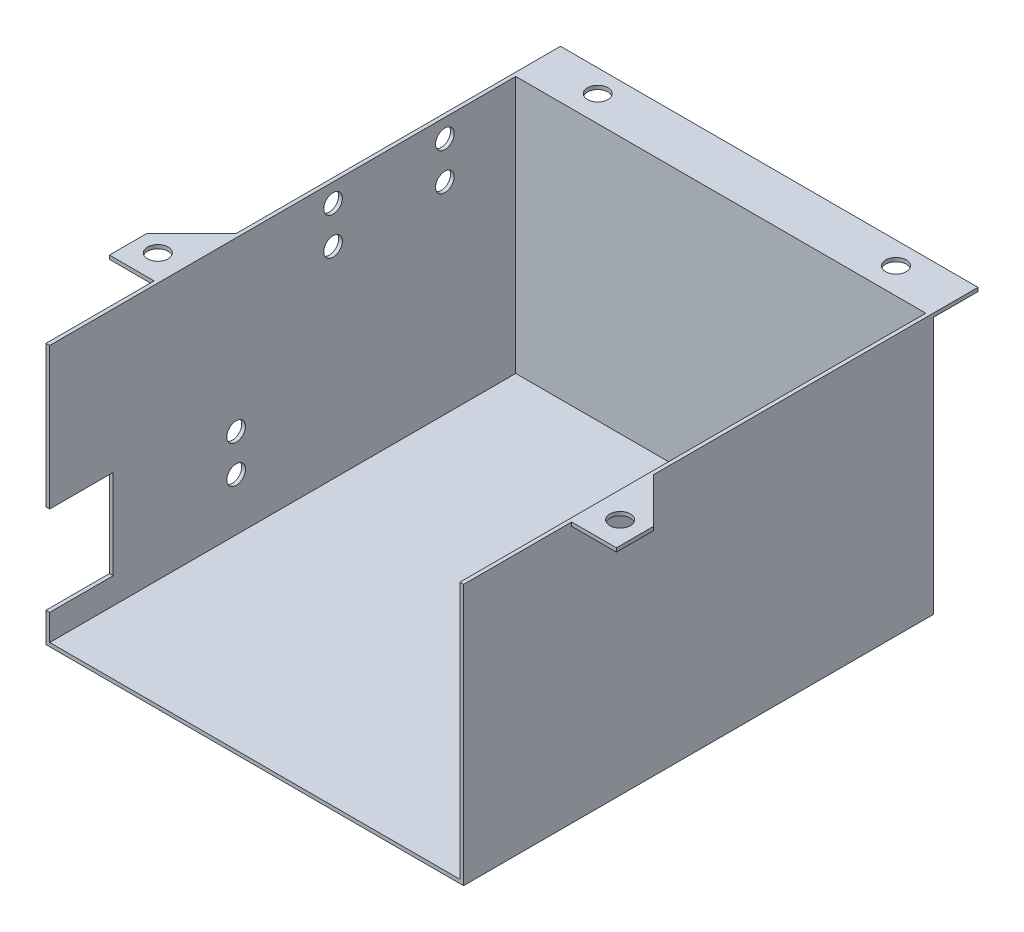
ISO-10303-21;
HEADER;
FILE_DESCRIPTION(('STEP AP214'),'2;1');
FILE_NAME('part.step','',(''),(''),'','','');
FILE_SCHEMA(('AUTOMOTIVE_DESIGN { 1 0 10303 214 1 1 1 1 }'));
ENDSEC;
DATA;
#1=APPLICATION_CONTEXT('core data for automotive mechanical design processes');
#2=APPLICATION_PROTOCOL_DEFINITION('international standard','automotive_design',2000,#1);
#3=PRODUCT_CONTEXT('',#1,'mechanical');
#4=PRODUCT('Part','Part','',(#3));
#5=PRODUCT_RELATED_PRODUCT_CATEGORY('part','',(#4));
#6=PRODUCT_DEFINITION_FORMATION('','',#4);
#7=PRODUCT_DEFINITION_CONTEXT('part definition',#1,'design');
#8=PRODUCT_DEFINITION('design','',#6,#7);
#9=PRODUCT_DEFINITION_SHAPE('','',#8);
#10=(LENGTH_UNIT() NAMED_UNIT(*) SI_UNIT(.MILLI.,.METRE.));
#11=(NAMED_UNIT(*) PLANE_ANGLE_UNIT() SI_UNIT($,.RADIAN.));
#12=(NAMED_UNIT(*) SI_UNIT($,.STERADIAN.) SOLID_ANGLE_UNIT());
#13=UNCERTAINTY_MEASURE_WITH_UNIT(LENGTH_MEASURE(1.E-05),#10,'distance_accuracy_value','');
#14=(GEOMETRIC_REPRESENTATION_CONTEXT(3) GLOBAL_UNCERTAINTY_ASSIGNED_CONTEXT((#13)) GLOBAL_UNIT_ASSIGNED_CONTEXT((#10,
#11,#12)) REPRESENTATION_CONTEXT('',''));
#15=CARTESIAN_POINT('',(0.,0.,0.));
#16=DIRECTION('',(0.,0.,1.));
#17=DIRECTION('',(1.,0.,0.));
#18=AXIS2_PLACEMENT_3D('',#15,#16,#17);
#19=CARTESIAN_POINT('',(0.,70.,126.));
#20=DIRECTION('',(0.,0.,-1.));
#21=DIRECTION('',(-1.,0.,0.));
#22=AXIS2_PLACEMENT_3D('',#19,#20,#21);
#23=PLANE('',#22);
#24=DIRECTION('',(0.,-1.,0.));
#25=VECTOR('',#24,1.);
#26=CARTESIAN_POINT('',(1.,70.,126.));
#27=LINE('',#26,#25);
#28=CARTESIAN_POINT('',(0.999999999999987,8.,126.));
#29=VERTEX_POINT('',#28);
#30=CARTESIAN_POINT('',(0.999999999999992,1.,126.));
#31=VERTEX_POINT('',#30);
#32=EDGE_CURVE('E263',#29,#31,#27,.T.);
#33=ORIENTED_EDGE('',*,*,#32,.F.);
#34=DIRECTION('',(-1.,0.,0.));
#35=VECTOR('',#34,1.);
#36=CARTESIAN_POINT('',(124.001025,8.,126.));
#37=LINE('',#36,#35);
#38=CARTESIAN_POINT('',(0.,8.,126.));
#39=VERTEX_POINT('',#38);
#40=EDGE_CURVE('E245',#29,#39,#37,.T.);
#41=ORIENTED_EDGE('',*,*,#40,.T.);
#42=DIRECTION('',(0.,-1.,0.));
#43=VECTOR('',#42,1.);
#44=CARTESIAN_POINT('',(0.,0.,126.));
#45=LINE('',#44,#43);
#46=CARTESIAN_POINT('',(0.,0.,126.));
#47=VERTEX_POINT('',#46);
#48=EDGE_CURVE('E322',#39,#47,#45,.T.);
#49=ORIENTED_EDGE('',*,*,#48,.T.);
#50=DIRECTION('',(1.,0.,0.));
#51=VECTOR('',#50,1.);
#52=CARTESIAN_POINT('',(0.,0.,126.));
#53=LINE('',#52,#51);
#54=CARTESIAN_POINT('',(112.,0.,126.));
#55=VERTEX_POINT('',#54);
#56=EDGE_CURVE('E330',#47,#55,#53,.T.);
#57=ORIENTED_EDGE('',*,*,#56,.T.);
#58=DIRECTION('',(0.,1.,0.));
#59=VECTOR('',#58,1.);
#60=CARTESIAN_POINT('',(112.,0.,126.));
#61=LINE('',#60,#59);
#62=CARTESIAN_POINT('',(112.,70.,126.));
#63=VERTEX_POINT('',#62);
#64=EDGE_CURVE('E333',#55,#63,#61,.T.);
#65=ORIENTED_EDGE('',*,*,#64,.T.);
#66=DIRECTION('',(-1.,0.,0.));
#67=VECTOR('',#66,1.);
#68=CARTESIAN_POINT('',(0.,70.,126.));
#69=LINE('',#68,#67);
#70=CARTESIAN_POINT('',(111.,70.,126.));
#71=VERTEX_POINT('',#70);
#72=EDGE_CURVE('E337',#63,#71,#69,.T.);
#73=ORIENTED_EDGE('',*,*,#72,.T.);
#74=DIRECTION('',(0.,1.,0.));
#75=VECTOR('',#74,1.);
#76=CARTESIAN_POINT('',(111.,70.,126.));
#77=LINE('',#76,#75);
#78=CARTESIAN_POINT('',(111.,1.,126.));
#79=VERTEX_POINT('',#78);
#80=EDGE_CURVE('E269',#79,#71,#77,.T.);
#81=ORIENTED_EDGE('',*,*,#80,.F.);
#82=DIRECTION('',(1.,0.,0.));
#83=VECTOR('',#82,1.);
#84=CARTESIAN_POINT('',(0.999999999999992,1.,126.));
#85=LINE('',#84,#83);
#86=EDGE_CURVE('E262',#31,#79,#85,.T.);
#87=ORIENTED_EDGE('',*,*,#86,.F.);
#88=EDGE_LOOP('',(#33,#41,#49,#57,#65,#73,#81,#87));
#89=FACE_BOUND('',#88,.T.);
#90=ADVANCED_FACE('F40',(#89),#23,.F.);
#91=CARTESIAN_POINT('',(0.,70.,126.));
#92=DIRECTION('',(0.,-1.,0.));
#93=DIRECTION('',(0.,0.,-1.));
#94=AXIS2_PLACEMENT_3D('',#91,#92,#93);
#95=PLANE('',#94);
#96=CARTESIAN_POINT('',(96.,70.,-6.));
#97=DIRECTION('',(0.,-1.,0.));
#98=DIRECTION('',(0.,0.,-1.));
#99=AXIS2_PLACEMENT_3D('',#96,#97,#98);
#100=CIRCLE('',#99,2.75000000000001);
#101=CARTESIAN_POINT('',(96.,70.,-8.75000000000001));
#102=VERTEX_POINT('',#101);
#103=EDGE_CURVE('E586',#102,#102,#100,.T.);
#104=ORIENTED_EDGE('',*,*,#103,.T.);
#105=EDGE_LOOP('',(#104));
#106=FACE_BOUND('',#105,.T.);
#107=CARTESIAN_POINT('',(16.,70.,-6.));
#108=DIRECTION('',(0.,-1.,0.));
#109=DIRECTION('',(0.,0.,-1.));
#110=AXIS2_PLACEMENT_3D('',#107,#108,#109);
#111=CIRCLE('',#110,2.75);
#112=CARTESIAN_POINT('',(16.,70.,-8.75));
#113=VERTEX_POINT('',#112);
#114=EDGE_CURVE('E476',#113,#113,#111,.T.);
#115=ORIENTED_EDGE('',*,*,#114,.T.);
#116=EDGE_LOOP('',(#115));
#117=FACE_BOUND('',#116,.T.);
#118=CARTESIAN_POINT('',(118.,70.,90.));
#119=DIRECTION('',(0.,-1.,0.));
#120=DIRECTION('',(0.,0.,-1.));
#121=AXIS2_PLACEMENT_3D('',#118,#119,#120);
#122=CIRCLE('',#121,2.75000000000001);
#123=CARTESIAN_POINT('',(118.,70.,87.25));
#124=VERTEX_POINT('',#123);
#125=EDGE_CURVE('E543',#124,#124,#122,.T.);
#126=ORIENTED_EDGE('',*,*,#125,.T.);
#127=EDGE_LOOP('',(#126));
#128=FACE_BOUND('',#127,.T.);
#129=CARTESIAN_POINT('',(-6.,70.,90.));
#130=DIRECTION('',(0.,-1.,0.));
#131=DIRECTION('',(0.,0.,-1.));
#132=AXIS2_PLACEMENT_3D('',#129,#130,#131);
#133=CIRCLE('',#132,2.75000000000001);
#134=CARTESIAN_POINT('',(-6.,70.,87.25));
#135=VERTEX_POINT('',#134);
#136=EDGE_CURVE('E535',#135,#135,#133,.T.);
#137=ORIENTED_EDGE('',*,*,#136,.T.);
#138=EDGE_LOOP('',(#137));
#139=FACE_BOUND('',#138,.T.);
#140=DIRECTION('',(-0.707106781186552,0.,0.707106781186544));
#141=VECTOR('',#140,1.);
#142=CARTESIAN_POINT('',(0.,70.,75.));
#143=LINE('',#142,#141);
#144=CARTESIAN_POINT('',(0.,70.,75.));
#145=VERTEX_POINT('',#144);
#146=CARTESIAN_POINT('',(-12.,70.,86.9999999999999));
#147=VERTEX_POINT('',#146);
#148=EDGE_CURVE('E538',#145,#147,#143,.T.);
#149=ORIENTED_EDGE('',*,*,#148,.T.);
#150=DIRECTION('',(0.,0.,1.));
#151=VECTOR('',#150,1.);
#152=CARTESIAN_POINT('',(-12.,70.,97.));
#153=LINE('',#152,#151);
#154=CARTESIAN_POINT('',(-12.,70.,97.));
#155=VERTEX_POINT('',#154);
#156=EDGE_CURVE('E547',#147,#155,#153,.T.);
#157=ORIENTED_EDGE('',*,*,#156,.T.);
#158=DIRECTION('',(1.,0.,0.));
#159=VECTOR('',#158,1.);
#160=CARTESIAN_POINT('',(-12.,70.,97.));
#161=LINE('',#160,#159);
#162=CARTESIAN_POINT('',(0.,70.,97.));
#163=VERTEX_POINT('',#162);
#164=EDGE_CURVE('E360',#155,#163,#161,.T.);
#165=ORIENTED_EDGE('',*,*,#164,.T.);
#166=DIRECTION('',(0.,0.,-1.));
#167=VECTOR('',#166,1.);
#168=CARTESIAN_POINT('',(0.,70.,126.));
#169=LINE('',#168,#167);
#170=CARTESIAN_POINT('',(0.,70.,126.));
#171=VERTEX_POINT('',#170);
#172=EDGE_CURVE('E349',#171,#163,#169,.T.);
#173=ORIENTED_EDGE('',*,*,#172,.F.);
#174=CARTESIAN_POINT('',(1.,70.,126.));
#175=VERTEX_POINT('',#174);
#176=EDGE_CURVE('E336',#175,#171,#69,.T.);
#177=ORIENTED_EDGE('',*,*,#176,.F.);
#178=DIRECTION('',(0.,0.,1.));
#179=VECTOR('',#178,1.);
#180=CARTESIAN_POINT('',(1.,70.,1.));
#181=LINE('',#180,#179);
#182=CARTESIAN_POINT('',(1.,70.,1.));
#183=VERTEX_POINT('',#182);
#184=EDGE_CURVE('E260',#183,#175,#181,.T.);
#185=ORIENTED_EDGE('',*,*,#184,.F.);
#186=DIRECTION('',(-1.,0.,0.));
#187=VECTOR('',#186,1.);
#188=CARTESIAN_POINT('',(1.,70.,1.));
#189=LINE('',#188,#187);
#190=CARTESIAN_POINT('',(111.,70.,1.));
#191=VERTEX_POINT('',#190);
#192=EDGE_CURVE('E291',#191,#183,#189,.T.);
#193=ORIENTED_EDGE('',*,*,#192,.F.);
#194=DIRECTION('',(0.,0.,1.));
#195=VECTOR('',#194,1.);
#196=CARTESIAN_POINT('',(111.,70.,1.));
#197=LINE('',#196,#195);
#198=EDGE_CURVE('E298',#191,#71,#197,.T.);
#199=ORIENTED_EDGE('',*,*,#198,.T.);
#200=ORIENTED_EDGE('',*,*,#72,.F.);
#201=DIRECTION('',(0.,0.,-1.));
#202=VECTOR('',#201,1.);
#203=CARTESIAN_POINT('',(112.,70.,126.));
#204=LINE('',#203,#202);
#205=CARTESIAN_POINT('',(112.,70.,97.));
#206=VERTEX_POINT('',#205);
#207=EDGE_CURVE('E421',#63,#206,#204,.T.);
#208=ORIENTED_EDGE('',*,*,#207,.T.);
#209=DIRECTION('',(-1.,0.,0.));
#210=VECTOR('',#209,1.);
#211=CARTESIAN_POINT('',(124.,70.,97.));
#212=LINE('',#211,#210);
#213=CARTESIAN_POINT('',(124.,70.,97.));
#214=VERTEX_POINT('',#213);
#215=EDGE_CURVE('E385',#214,#206,#212,.T.);
#216=ORIENTED_EDGE('',*,*,#215,.F.);
#217=DIRECTION('',(0.,0.,1.));
#218=VECTOR('',#217,1.);
#219=CARTESIAN_POINT('',(124.,70.,97.));
#220=LINE('',#219,#218);
#221=CARTESIAN_POINT('',(124.,70.,86.9999999999999));
#222=VERTEX_POINT('',#221);
#223=EDGE_CURVE('E382',#222,#214,#220,.T.);
#224=ORIENTED_EDGE('',*,*,#223,.F.);
#225=DIRECTION('',(0.707106781186552,0.,0.707106781186544));
#226=VECTOR('',#225,1.);
#227=CARTESIAN_POINT('',(112.,70.,75.));
#228=LINE('',#227,#226);
#229=CARTESIAN_POINT('',(112.,70.,75.));
#230=VERTEX_POINT('',#229);
#231=EDGE_CURVE('E356',#230,#222,#228,.T.);
#232=ORIENTED_EDGE('',*,*,#231,.F.);
#233=CARTESIAN_POINT('',(112.,70.,-12.));
#234=VERTEX_POINT('',#233);
#235=EDGE_CURVE('E353',#230,#234,#204,.T.);
#236=ORIENTED_EDGE('',*,*,#235,.T.);
#237=DIRECTION('',(1.,0.,0.));
#238=VECTOR('',#237,1.);
#239=CARTESIAN_POINT('',(112.,70.,-12.));
#240=LINE('',#239,#238);
#241=CARTESIAN_POINT('',(0.,70.,-12.));
#242=VERTEX_POINT('',#241);
#243=EDGE_CURVE('E274',#242,#234,#240,.T.);
#244=ORIENTED_EDGE('',*,*,#243,.F.);
#245=EDGE_CURVE('E341',#145,#242,#169,.T.);
#246=ORIENTED_EDGE('',*,*,#245,.F.);
#247=EDGE_LOOP('',(#149,#157,#165,#173,#177,#185,#193,#199,#200,#208,#216,#224,#232,#236,#244,#246));
#248=FACE_BOUND('',#247,.T.);
#249=ADVANCED_FACE('F445',(#106,#117,#128,#139,#248),#95,.F.);
#250=CARTESIAN_POINT('',(-12.,69.,97.));
#251=DIRECTION('',(0.,-1.,0.));
#252=DIRECTION('',(0.,0.,-1.));
#253=AXIS2_PLACEMENT_3D('',#250,#251,#252);
#254=PLANE('',#253);
#255=CARTESIAN_POINT('',(-6.,69.,90.));
#256=DIRECTION('',(0.,-1.,0.));
#257=DIRECTION('',(0.,0.,-1.));
#258=AXIS2_PLACEMENT_3D('',#255,#256,#257);
#259=CIRCLE('',#258,2.75000000000001);
#260=CARTESIAN_POINT('',(-6.,69.,87.25));
#261=VERTEX_POINT('',#260);
#262=EDGE_CURVE('E539',#261,#261,#259,.T.);
#263=ORIENTED_EDGE('',*,*,#262,.F.);
#264=EDGE_LOOP('',(#263));
#265=FACE_BOUND('',#264,.T.);
#266=DIRECTION('',(0.,0.,-1.));
#267=VECTOR('',#266,1.);
#268=CARTESIAN_POINT('',(-12.,69.,97.));
#269=LINE('',#268,#267);
#270=CARTESIAN_POINT('',(-12.,69.,97.));
#271=VERTEX_POINT('',#270);
#272=CARTESIAN_POINT('',(-12.,69.,86.9999999999999));
#273=VERTEX_POINT('',#272);
#274=EDGE_CURVE('E529',#271,#273,#269,.T.);
#275=ORIENTED_EDGE('',*,*,#274,.T.);
#276=DIRECTION('',(0.707106781186552,0.,-0.707106781186544));
#277=VECTOR('',#276,1.);
#278=CARTESIAN_POINT('',(-17.0000000000001,69.,91.9999999999999));
#279=LINE('',#278,#277);
#280=CARTESIAN_POINT('',(0.,69.,75.));
#281=VERTEX_POINT('',#280);
#282=EDGE_CURVE('E72',#273,#281,#279,.T.);
#283=ORIENTED_EDGE('',*,*,#282,.T.);
#284=DIRECTION('',(0.,0.,-1.));
#285=VECTOR('',#284,1.);
#286=CARTESIAN_POINT('',(0.,69.,97.));
#287=LINE('',#286,#285);
#288=CARTESIAN_POINT('',(0.,69.,97.));
#289=VERTEX_POINT('',#288);
#290=EDGE_CURVE('E531',#289,#281,#287,.T.);
#291=ORIENTED_EDGE('',*,*,#290,.F.);
#292=DIRECTION('',(1.,0.,0.));
#293=VECTOR('',#292,1.);
#294=CARTESIAN_POINT('',(-12.,69.,97.));
#295=LINE('',#294,#293);
#296=EDGE_CURVE('E526',#271,#289,#295,.T.);
#297=ORIENTED_EDGE('',*,*,#296,.F.);
#298=EDGE_LOOP('',(#275,#283,#291,#297));
#299=FACE_BOUND('',#298,.T.);
#300=ADVANCED_FACE('F637',(#265,#299),#254,.T.);
#301=CARTESIAN_POINT('',(-12.,69.,97.));
#302=DIRECTION('',(-1.,0.,0.));
#303=DIRECTION('',(0.,0.,-1.));
#304=AXIS2_PLACEMENT_3D('',#301,#302,#303);
#305=PLANE('',#304);
#306=ORIENTED_EDGE('',*,*,#156,.F.);
#307=DIRECTION('',(0.,-1.,0.));
#308=VECTOR('',#307,1.);
#309=CARTESIAN_POINT('',(-12.,69.,86.9999999999999));
#310=LINE('',#309,#308);
#311=EDGE_CURVE('E11',#147,#273,#310,.T.);
#312=ORIENTED_EDGE('',*,*,#311,.T.);
#313=ORIENTED_EDGE('',*,*,#274,.F.);
#314=DIRECTION('',(0.,-1.,0.));
#315=VECTOR('',#314,1.);
#316=CARTESIAN_POINT('',(-12.,70.,97.));
#317=LINE('',#316,#315);
#318=EDGE_CURVE('E533',#155,#271,#317,.T.);
#319=ORIENTED_EDGE('',*,*,#318,.F.);
#320=EDGE_LOOP('',(#306,#312,#313,#319));
#321=FACE_BOUND('',#320,.T.);
#322=ADVANCED_FACE('F657',(#321),#305,.T.);
#323=CARTESIAN_POINT('',(112.,0.,126.));
#324=DIRECTION('',(-1.,0.,0.));
#325=DIRECTION('',(0.,0.,1.));
#326=AXIS2_PLACEMENT_3D('',#323,#324,#325);
#327=PLANE('',#326);
#328=DIRECTION('',(0.,1.,0.));
#329=VECTOR('',#328,1.);
#330=CARTESIAN_POINT('',(112.,70.,75.));
#331=LINE('',#330,#329);
#332=CARTESIAN_POINT('',(112.,69.,75.));
#333=VERTEX_POINT('',#332);
#334=EDGE_CURVE('E363',#333,#230,#331,.T.);
#335=ORIENTED_EDGE('',*,*,#334,.F.);
#336=DIRECTION('',(0.,0.,-1.));
#337=VECTOR('',#336,1.);
#338=CARTESIAN_POINT('',(112.,69.,97.));
#339=LINE('',#338,#337);
#340=CARTESIAN_POINT('',(112.,69.,97.));
#341=VERTEX_POINT('',#340);
#342=EDGE_CURVE('E368',#341,#333,#339,.T.);
#343=ORIENTED_EDGE('',*,*,#342,.F.);
#344=DIRECTION('',(0.,-1.,0.));
#345=VECTOR('',#344,1.);
#346=CARTESIAN_POINT('',(112.,70.,97.));
#347=LINE('',#346,#345);
#348=EDGE_CURVE('E428',#206,#341,#347,.T.);
#349=ORIENTED_EDGE('',*,*,#348,.F.);
#350=ORIENTED_EDGE('',*,*,#207,.F.);
#351=ORIENTED_EDGE('',*,*,#64,.F.);
#352=DIRECTION('',(0.,0.,-1.));
#353=VECTOR('',#352,1.);
#354=CARTESIAN_POINT('',(112.,0.,126.));
#355=LINE('',#354,#353);
#356=CARTESIAN_POINT('',(112.,0.,0.));
#357=VERTEX_POINT('',#356);
#358=EDGE_CURVE('E425',#55,#357,#355,.T.);
#359=ORIENTED_EDGE('',*,*,#358,.T.);
#360=DIRECTION('',(0.,1.,0.));
#361=VECTOR('',#360,1.);
#362=CARTESIAN_POINT('',(112.,0.,0.));
#363=LINE('',#362,#361);
#364=CARTESIAN_POINT('',(112.,69.,0.));
#365=VERTEX_POINT('',#364);
#366=EDGE_CURVE('E318',#357,#365,#363,.T.);
#367=ORIENTED_EDGE('',*,*,#366,.T.);
#368=DIRECTION('',(0.,0.,1.));
#369=VECTOR('',#368,1.);
#370=CARTESIAN_POINT('',(112.,69.,-12.));
#371=LINE('',#370,#369);
#372=CARTESIAN_POINT('',(112.,69.,-12.));
#373=VERTEX_POINT('',#372);
#374=EDGE_CURVE('E272',#373,#365,#371,.T.);
#375=ORIENTED_EDGE('',*,*,#374,.F.);
#376=DIRECTION('',(0.,-1.,0.));
#377=VECTOR('',#376,1.);
#378=CARTESIAN_POINT('',(112.,70.,-12.));
#379=LINE('',#378,#377);
#380=EDGE_CURVE('E391',#234,#373,#379,.T.);
#381=ORIENTED_EDGE('',*,*,#380,.F.);
#382=ORIENTED_EDGE('',*,*,#235,.F.);
#383=EDGE_LOOP('',(#335,#343,#349,#350,#351,#359,#367,#375,#381,#382));
#384=FACE_BOUND('',#383,.T.);
#385=ADVANCED_FACE('F452',(#384),#327,.F.);
#386=CARTESIAN_POINT('',(0.,0.,126.));
#387=DIRECTION('',(1.,0.,0.));
#388=DIRECTION('',(0.,0.,-1.));
#389=AXIS2_PLACEMENT_3D('',#386,#387,#388);
#390=PLANE('',#389);
#391=CARTESIAN_POINT('',(0.,15.,76.));
#392=DIRECTION('',(-1.,0.,0.));
#393=DIRECTION('',(0.,0.,1.));
#394=AXIS2_PLACEMENT_3D('',#391,#392,#393);
#395=CIRCLE('',#394,2.5);
#396=CARTESIAN_POINT('',(0.,15.,78.5));
#397=VERTEX_POINT('',#396);
#398=EDGE_CURVE('E505',#397,#397,#395,.T.);
#399=ORIENTED_EDGE('',*,*,#398,.F.);
#400=EDGE_LOOP('',(#399));
#401=FACE_BOUND('',#400,.T.);
#402=CARTESIAN_POINT('',(0.,25.,76.));
#403=DIRECTION('',(-1.,0.,0.));
#404=DIRECTION('',(0.,0.,1.));
#405=AXIS2_PLACEMENT_3D('',#402,#403,#404);
#406=CIRCLE('',#405,2.50000000000001);
#407=CARTESIAN_POINT('',(0.,25.,78.5));
#408=VERTEX_POINT('',#407);
#409=EDGE_CURVE('E499',#408,#408,#406,.T.);
#410=ORIENTED_EDGE('',*,*,#409,.F.);
#411=EDGE_LOOP('',(#410));
#412=FACE_BOUND('',#411,.T.);
#413=CARTESIAN_POINT('',(0.,55.,50.));
#414=DIRECTION('',(-1.,0.,0.));
#415=DIRECTION('',(0.,0.,1.));
#416=AXIS2_PLACEMENT_3D('',#413,#414,#415);
#417=CIRCLE('',#416,2.5);
#418=CARTESIAN_POINT('',(0.,55.,52.5));
#419=VERTEX_POINT('',#418);
#420=EDGE_CURVE('E498',#419,#419,#417,.T.);
#421=ORIENTED_EDGE('',*,*,#420,.F.);
#422=EDGE_LOOP('',(#421));
#423=FACE_BOUND('',#422,.T.);
#424=CARTESIAN_POINT('',(0.,65.0000000000001,50.));
#425=DIRECTION('',(-1.,0.,0.));
#426=DIRECTION('',(0.,0.,1.));
#427=AXIS2_PLACEMENT_3D('',#424,#425,#426);
#428=CIRCLE('',#427,2.5);
#429=CARTESIAN_POINT('',(0.,65.0000000000001,52.5));
#430=VERTEX_POINT('',#429);
#431=EDGE_CURVE('E518',#430,#430,#428,.T.);
#432=ORIENTED_EDGE('',*,*,#431,.F.);
#433=EDGE_LOOP('',(#432));
#434=FACE_BOUND('',#433,.T.);
#435=CARTESIAN_POINT('',(0.,55.,20.));
#436=DIRECTION('',(-1.,0.,0.));
#437=DIRECTION('',(0.,0.,1.));
#438=AXIS2_PLACEMENT_3D('',#435,#436,#437);
#439=CIRCLE('',#438,2.5);
#440=CARTESIAN_POINT('',(0.,55.,22.5));
#441=VERTEX_POINT('',#440);
#442=EDGE_CURVE('E562',#441,#441,#439,.T.);
#443=ORIENTED_EDGE('',*,*,#442,.F.);
#444=EDGE_LOOP('',(#443));
#445=FACE_BOUND('',#444,.T.);
#446=CARTESIAN_POINT('',(0.,65.,20.));
#447=DIRECTION('',(-1.,0.,0.));
#448=DIRECTION('',(0.,0.,1.));
#449=AXIS2_PLACEMENT_3D('',#446,#447,#448);
#450=CIRCLE('',#449,2.5);
#451=CARTESIAN_POINT('',(0.,65.,22.5));
#452=VERTEX_POINT('',#451);
#453=EDGE_CURVE('E573',#452,#452,#450,.T.);
#454=ORIENTED_EDGE('',*,*,#453,.F.);
#455=EDGE_LOOP('',(#454));
#456=FACE_BOUND('',#455,.T.);
#457=ORIENTED_EDGE('',*,*,#48,.F.);
#458=DIRECTION('',(0.,0.,1.));
#459=VECTOR('',#458,1.);
#460=CARTESIAN_POINT('',(0.,8.,126.));
#461=LINE('',#460,#459);
#462=CARTESIAN_POINT('',(0.,8.,109.));
#463=VERTEX_POINT('',#462);
#464=EDGE_CURVE('E256',#463,#39,#461,.T.);
#465=ORIENTED_EDGE('',*,*,#464,.F.);
#466=DIRECTION('',(0.,-1.,0.));
#467=VECTOR('',#466,1.);
#468=CARTESIAN_POINT('',(0.,32.,109.));
#469=LINE('',#468,#467);
#470=CARTESIAN_POINT('',(0.,32.,109.));
#471=VERTEX_POINT('',#470);
#472=EDGE_CURVE('E490',#471,#463,#469,.T.);
#473=ORIENTED_EDGE('',*,*,#472,.F.);
#474=DIRECTION('',(0.,0.,-1.));
#475=VECTOR('',#474,1.);
#476=CARTESIAN_POINT('',(0.,32.,126.));
#477=LINE('',#476,#475);
#478=CARTESIAN_POINT('',(0.,32.,126.));
#479=VERTEX_POINT('',#478);
#480=EDGE_CURVE('E487',#479,#471,#477,.T.);
#481=ORIENTED_EDGE('',*,*,#480,.F.);
#482=EDGE_CURVE('E254',#171,#479,#45,.T.);
#483=ORIENTED_EDGE('',*,*,#482,.F.);
#484=ORIENTED_EDGE('',*,*,#172,.T.);
#485=DIRECTION('',(0.,-1.,0.));
#486=VECTOR('',#485,1.);
#487=CARTESIAN_POINT('',(0.,70.,97.));
#488=LINE('',#487,#486);
#489=EDGE_CURVE('E521',#163,#289,#488,.T.);
#490=ORIENTED_EDGE('',*,*,#489,.T.);
#491=ORIENTED_EDGE('',*,*,#290,.T.);
#492=DIRECTION('',(0.,1.,0.));
#493=VECTOR('',#492,1.);
#494=CARTESIAN_POINT('',(0.,70.,75.));
#495=LINE('',#494,#493);
#496=EDGE_CURVE('E474',#281,#145,#495,.T.);
#497=ORIENTED_EDGE('',*,*,#496,.T.);
#498=ORIENTED_EDGE('',*,*,#245,.T.);
#499=DIRECTION('',(0.,1.,0.));
#500=VECTOR('',#499,1.);
#501=CARTESIAN_POINT('',(0.,70.,-12.));
#502=LINE('',#501,#500);
#503=CARTESIAN_POINT('',(0.,69.,-12.));
#504=VERTEX_POINT('',#503);
#505=EDGE_CURVE('E397',#504,#242,#502,.T.);
#506=ORIENTED_EDGE('',*,*,#505,.F.);
#507=DIRECTION('',(0.,0.,1.));
#508=VECTOR('',#507,1.);
#509=CARTESIAN_POINT('',(0.,69.,-12.));
#510=LINE('',#509,#508);
#511=CARTESIAN_POINT('',(0.,69.,0.));
#512=VERTEX_POINT('',#511);
#513=EDGE_CURVE('E407',#504,#512,#510,.T.);
#514=ORIENTED_EDGE('',*,*,#513,.T.);
#515=DIRECTION('',(0.,-1.,0.));
#516=VECTOR('',#515,1.);
#517=CARTESIAN_POINT('',(0.,0.,0.));
#518=LINE('',#517,#516);
#519=CARTESIAN_POINT('',(0.,0.,0.));
#520=VERTEX_POINT('',#519);
#521=EDGE_CURVE('E297',#512,#520,#518,.T.);
#522=ORIENTED_EDGE('',*,*,#521,.T.);
#523=DIRECTION('',(0.,0.,-1.));
#524=VECTOR('',#523,1.);
#525=CARTESIAN_POINT('',(0.,0.,126.));
#526=LINE('',#525,#524);
#527=EDGE_CURVE('E316',#47,#520,#526,.T.);
#528=ORIENTED_EDGE('',*,*,#527,.F.);
#529=EDGE_LOOP('',(#457,#465,#473,#481,#483,#484,#490,#491,#497,#498,#506,#514,#522,#528));
#530=FACE_BOUND('',#529,.T.);
#531=ADVANCED_FACE('F42',(#401,#412,#423,#434,#445,#456,#530),#390,.F.);
#532=CARTESIAN_POINT('',(0.,0.,126.));
#533=DIRECTION('',(0.,1.,0.));
#534=DIRECTION('',(0.,0.,1.));
#535=AXIS2_PLACEMENT_3D('',#532,#533,#534);
#536=PLANE('',#535);
#537=DIRECTION('',(1.,0.,0.));
#538=VECTOR('',#537,1.);
#539=CARTESIAN_POINT('',(0.,0.,0.));
#540=LINE('',#539,#538);
#541=EDGE_CURVE('E310',#520,#357,#540,.T.);
#542=ORIENTED_EDGE('',*,*,#541,.T.);
#543=ORIENTED_EDGE('',*,*,#358,.F.);
#544=ORIENTED_EDGE('',*,*,#56,.F.);
#545=ORIENTED_EDGE('',*,*,#527,.T.);
#546=EDGE_LOOP('',(#542,#543,#544,#545));
#547=FACE_BOUND('',#546,.T.);
#548=ADVANCED_FACE('F644',(#547),#536,.F.);
#549=ORIENTED_EDGE('',*,*,#482,.T.);
#550=DIRECTION('',(-1.,0.,0.));
#551=VECTOR('',#550,1.);
#552=CARTESIAN_POINT('',(124.001025,32.,126.));
#553=LINE('',#552,#551);
#554=CARTESIAN_POINT('',(0.999999999999996,32.,126.));
#555=VERTEX_POINT('',#554);
#556=EDGE_CURVE('E238',#555,#479,#553,.T.);
#557=ORIENTED_EDGE('',*,*,#556,.F.);
#558=EDGE_CURVE('E251',#175,#555,#27,.T.);
#559=ORIENTED_EDGE('',*,*,#558,.F.);
#560=ORIENTED_EDGE('',*,*,#176,.T.);
#561=EDGE_LOOP('',(#549,#557,#559,#560));
#562=FACE_BOUND('',#561,.T.);
#563=ADVANCED_FACE('F250',(#562),#23,.F.);
#564=CARTESIAN_POINT('',(0.,70.,0.));
#565=DIRECTION('',(0.,0.,-1.));
#566=DIRECTION('',(-1.,0.,0.));
#567=AXIS2_PLACEMENT_3D('',#564,#565,#566);
#568=PLANE('',#567);
#569=DIRECTION('',(-1.,0.,0.));
#570=VECTOR('',#569,1.);
#571=CARTESIAN_POINT('',(112.,69.,0.));
#572=LINE('',#571,#570);
#573=EDGE_CURVE('E323',#365,#512,#572,.T.);
#574=ORIENTED_EDGE('',*,*,#573,.F.);
#575=ORIENTED_EDGE('',*,*,#366,.F.);
#576=ORIENTED_EDGE('',*,*,#541,.F.);
#577=ORIENTED_EDGE('',*,*,#521,.F.);
#578=EDGE_LOOP('',(#574,#575,#576,#577));
#579=FACE_BOUND('',#578,.T.);
#580=ADVANCED_FACE('F643',(#579),#568,.T.);
#581=CARTESIAN_POINT('',(1.,70.,1.));
#582=DIRECTION('',(-1.,0.,0.));
#583=DIRECTION('',(0.,-1.,0.));
#584=AXIS2_PLACEMENT_3D('',#581,#582,#583);
#585=PLANE('',#584);
#586=CARTESIAN_POINT('',(0.999999999999994,15.,76.));
#587=DIRECTION('',(-1.,0.,0.));
#588=DIRECTION('',(0.,-1.,0.));
#589=AXIS2_PLACEMENT_3D('',#586,#587,#588);
#590=CIRCLE('',#589,2.5);
#591=CARTESIAN_POINT('',(0.999999999999994,12.5,76.));
#592=VERTEX_POINT('',#591);
#593=EDGE_CURVE('E44',#592,#592,#590,.T.);
#594=ORIENTED_EDGE('',*,*,#593,.T.);
#595=EDGE_LOOP('',(#594));
#596=FACE_BOUND('',#595,.T.);
#597=CARTESIAN_POINT('',(0.999999999999996,25.,76.));
#598=DIRECTION('',(-1.,0.,0.));
#599=DIRECTION('',(0.,-1.,0.));
#600=AXIS2_PLACEMENT_3D('',#597,#598,#599);
#601=CIRCLE('',#600,2.50000000000001);
#602=CARTESIAN_POINT('',(0.999999999999995,22.5,76.));
#603=VERTEX_POINT('',#602);
#604=EDGE_CURVE('E495',#603,#603,#601,.T.);
#605=ORIENTED_EDGE('',*,*,#604,.T.);
#606=EDGE_LOOP('',(#605));
#607=FACE_BOUND('',#606,.T.);
#608=CARTESIAN_POINT('',(0.999999999999999,55.,50.));
#609=DIRECTION('',(-1.,0.,0.));
#610=DIRECTION('',(0.,-1.,0.));
#611=AXIS2_PLACEMENT_3D('',#608,#609,#610);
#612=CIRCLE('',#611,2.5);
#613=CARTESIAN_POINT('',(0.999999999999999,52.5,50.));
#614=VERTEX_POINT('',#613);
#615=EDGE_CURVE('E515',#614,#614,#612,.T.);
#616=ORIENTED_EDGE('',*,*,#615,.T.);
#617=EDGE_LOOP('',(#616));
#618=FACE_BOUND('',#617,.T.);
#619=CARTESIAN_POINT('',(1.,65.0000000000001,50.));
#620=DIRECTION('',(-1.,0.,0.));
#621=DIRECTION('',(0.,-1.,0.));
#622=AXIS2_PLACEMENT_3D('',#619,#620,#621);
#623=CIRCLE('',#622,2.5);
#624=CARTESIAN_POINT('',(1.,62.5000000000001,50.));
#625=VERTEX_POINT('',#624);
#626=EDGE_CURVE('E559',#625,#625,#623,.T.);
#627=ORIENTED_EDGE('',*,*,#626,.T.);
#628=EDGE_LOOP('',(#627));
#629=FACE_BOUND('',#628,.T.);
#630=CARTESIAN_POINT('',(0.999999999999999,55.,20.));
#631=DIRECTION('',(-1.,0.,0.));
#632=DIRECTION('',(0.,-1.,0.));
#633=AXIS2_PLACEMENT_3D('',#630,#631,#632);
#634=CIRCLE('',#633,2.5);
#635=CARTESIAN_POINT('',(0.999999999999999,52.5,20.));
#636=VERTEX_POINT('',#635);
#637=EDGE_CURVE('E572',#636,#636,#634,.T.);
#638=ORIENTED_EDGE('',*,*,#637,.T.);
#639=EDGE_LOOP('',(#638));
#640=FACE_BOUND('',#639,.T.);
#641=CARTESIAN_POINT('',(1.,65.,20.));
#642=DIRECTION('',(-1.,0.,0.));
#643=DIRECTION('',(0.,-1.,0.));
#644=AXIS2_PLACEMENT_3D('',#641,#642,#643);
#645=CIRCLE('',#644,2.5);
#646=CARTESIAN_POINT('',(1.,62.5,20.));
#647=VERTEX_POINT('',#646);
#648=EDGE_CURVE('E577',#647,#647,#645,.T.);
#649=ORIENTED_EDGE('',*,*,#648,.T.);
#650=EDGE_LOOP('',(#649));
#651=FACE_BOUND('',#650,.T.);
#652=DIRECTION('',(0.,1.,0.));
#653=VECTOR('',#652,1.);
#654=CARTESIAN_POINT('',(1.,32.,109.));
#655=LINE('',#654,#653);
#656=CARTESIAN_POINT('',(1.,8.,109.));
#657=VERTEX_POINT('',#656);
#658=CARTESIAN_POINT('',(0.999999999999996,32.,109.));
#659=VERTEX_POINT('',#658);
#660=EDGE_CURVE('E61',#657,#659,#655,.T.);
#661=ORIENTED_EDGE('',*,*,#660,.F.);
#662=DIRECTION('',(0.,0.,-1.));
#663=VECTOR('',#662,1.);
#664=CARTESIAN_POINT('',(0.999999999999987,8.,126.));
#665=LINE('',#664,#663);
#666=EDGE_CURVE('E484',#29,#657,#665,.T.);
#667=ORIENTED_EDGE('',*,*,#666,.F.);
#668=ORIENTED_EDGE('',*,*,#32,.T.);
#669=DIRECTION('',(0.,0.,1.));
#670=VECTOR('',#669,1.);
#671=CARTESIAN_POINT('',(0.999999999999992,1.,1.));
#672=LINE('',#671,#670);
#673=CARTESIAN_POINT('',(0.999999999999992,1.,1.));
#674=VERTEX_POINT('',#673);
#675=EDGE_CURVE('E295',#674,#31,#672,.T.);
#676=ORIENTED_EDGE('',*,*,#675,.F.);
#677=DIRECTION('',(0.,-1.,0.));
#678=VECTOR('',#677,1.);
#679=CARTESIAN_POINT('',(1.,70.,1.));
#680=LINE('',#679,#678);
#681=EDGE_CURVE('E279',#183,#674,#680,.T.);
#682=ORIENTED_EDGE('',*,*,#681,.F.);
#683=ORIENTED_EDGE('',*,*,#184,.T.);
#684=ORIENTED_EDGE('',*,*,#558,.T.);
#685=DIRECTION('',(0.,0.,1.));
#686=VECTOR('',#685,1.);
#687=CARTESIAN_POINT('',(1.,32.,126.));
#688=LINE('',#687,#686);
#689=EDGE_CURVE('E234',#659,#555,#688,.T.);
#690=ORIENTED_EDGE('',*,*,#689,.F.);
#691=EDGE_LOOP('',(#661,#667,#668,#676,#682,#683,#684,#690));
#692=FACE_BOUND('',#691,.T.);
#693=ADVANCED_FACE('F258',(#596,#607,#618,#629,#640,#651,#692),#585,.F.);
#694=CARTESIAN_POINT('',(111.,70.,1.));
#695=DIRECTION('',(1.,0.,0.));
#696=DIRECTION('',(0.,0.,-1.));
#697=AXIS2_PLACEMENT_3D('',#694,#695,#696);
#698=PLANE('',#697);
#699=ORIENTED_EDGE('',*,*,#80,.T.);
#700=ORIENTED_EDGE('',*,*,#198,.F.);
#701=DIRECTION('',(0.,1.,0.));
#702=VECTOR('',#701,1.);
#703=CARTESIAN_POINT('',(111.,70.,1.));
#704=LINE('',#703,#702);
#705=CARTESIAN_POINT('',(111.,1.,1.));
#706=VERTEX_POINT('',#705);
#707=EDGE_CURVE('E287',#706,#191,#704,.T.);
#708=ORIENTED_EDGE('',*,*,#707,.F.);
#709=DIRECTION('',(0.,0.,1.));
#710=VECTOR('',#709,1.);
#711=CARTESIAN_POINT('',(111.,1.,1.));
#712=LINE('',#711,#710);
#713=EDGE_CURVE('E302',#706,#79,#712,.T.);
#714=ORIENTED_EDGE('',*,*,#713,.T.);
#715=EDGE_LOOP('',(#699,#700,#708,#714));
#716=FACE_BOUND('',#715,.T.);
#717=ADVANCED_FACE('F696',(#716),#698,.F.);
#718=CARTESIAN_POINT('',(0.999999999999992,1.,1.));
#719=DIRECTION('',(0.,-1.,0.));
#720=DIRECTION('',(0.,0.,-1.));
#721=AXIS2_PLACEMENT_3D('',#718,#719,#720);
#722=PLANE('',#721);
#723=ORIENTED_EDGE('',*,*,#86,.T.);
#724=ORIENTED_EDGE('',*,*,#713,.F.);
#725=DIRECTION('',(1.,0.,0.));
#726=VECTOR('',#725,1.);
#727=CARTESIAN_POINT('',(0.999999999999992,1.,1.));
#728=LINE('',#727,#726);
#729=EDGE_CURVE('E283',#674,#706,#728,.T.);
#730=ORIENTED_EDGE('',*,*,#729,.F.);
#731=ORIENTED_EDGE('',*,*,#675,.T.);
#732=EDGE_LOOP('',(#723,#724,#730,#731));
#733=FACE_BOUND('',#732,.T.);
#734=ADVANCED_FACE('F694',(#733),#722,.F.);
#735=CARTESIAN_POINT('',(0.999999999999992,1.,1.));
#736=DIRECTION('',(0.,0.,1.));
#737=DIRECTION('',(1.,0.,0.));
#738=AXIS2_PLACEMENT_3D('',#735,#736,#737);
#739=PLANE('',#738);
#740=ORIENTED_EDGE('',*,*,#681,.T.);
#741=ORIENTED_EDGE('',*,*,#729,.T.);
#742=ORIENTED_EDGE('',*,*,#707,.T.);
#743=ORIENTED_EDGE('',*,*,#192,.T.);
#744=EDGE_LOOP('',(#740,#741,#742,#743));
#745=FACE_BOUND('',#744,.T.);
#746=ADVANCED_FACE('F690',(#745),#739,.T.);
#747=CARTESIAN_POINT('',(112.,69.,-12.));
#748=DIRECTION('',(0.,1.,0.));
#749=DIRECTION('',(0.,0.,1.));
#750=AXIS2_PLACEMENT_3D('',#747,#748,#749);
#751=PLANE('',#750);
#752=CARTESIAN_POINT('',(96.,69.,-6.));
#753=DIRECTION('',(0.,-1.,0.));
#754=DIRECTION('',(0.,0.,-1.));
#755=AXIS2_PLACEMENT_3D('',#752,#753,#754);
#756=CIRCLE('',#755,2.75000000000001);
#757=CARTESIAN_POINT('',(96.,69.,-8.75000000000001));
#758=VERTEX_POINT('',#757);
#759=EDGE_CURVE('E244',#758,#758,#756,.T.);
#760=ORIENTED_EDGE('',*,*,#759,.F.);
#761=EDGE_LOOP('',(#760));
#762=FACE_BOUND('',#761,.T.);
#763=CARTESIAN_POINT('',(16.,69.,-6.));
#764=DIRECTION('',(0.,-1.,0.));
#765=DIRECTION('',(0.,0.,-1.));
#766=AXIS2_PLACEMENT_3D('',#763,#764,#765);
#767=CIRCLE('',#766,2.75);
#768=CARTESIAN_POINT('',(16.,69.,-8.75));
#769=VERTEX_POINT('',#768);
#770=EDGE_CURVE('E590',#769,#769,#767,.T.);
#771=ORIENTED_EDGE('',*,*,#770,.F.);
#772=EDGE_LOOP('',(#771));
#773=FACE_BOUND('',#772,.T.);
#774=ORIENTED_EDGE('',*,*,#573,.T.);
#775=ORIENTED_EDGE('',*,*,#513,.F.);
#776=DIRECTION('',(-1.,0.,0.));
#777=VECTOR('',#776,1.);
#778=CARTESIAN_POINT('',(112.,69.,-12.));
#779=LINE('',#778,#777);
#780=EDGE_CURVE('E395',#373,#504,#779,.T.);
#781=ORIENTED_EDGE('',*,*,#780,.F.);
#782=ORIENTED_EDGE('',*,*,#374,.T.);
#783=EDGE_LOOP('',(#774,#775,#781,#782));
#784=FACE_BOUND('',#783,.T.);
#785=ADVANCED_FACE('F469',(#762,#773,#784),#751,.F.);
#786=CARTESIAN_POINT('',(112.,69.,-12.));
#787=DIRECTION('',(0.,0.,-1.));
#788=DIRECTION('',(-1.,0.,0.));
#789=AXIS2_PLACEMENT_3D('',#786,#787,#788);
#790=PLANE('',#789);
#791=ORIENTED_EDGE('',*,*,#380,.T.);
#792=ORIENTED_EDGE('',*,*,#780,.T.);
#793=ORIENTED_EDGE('',*,*,#505,.T.);
#794=ORIENTED_EDGE('',*,*,#243,.T.);
#795=EDGE_LOOP('',(#791,#792,#793,#794));
#796=FACE_BOUND('',#795,.T.);
#797=ADVANCED_FACE('F466',(#796),#790,.T.);
#798=CARTESIAN_POINT('',(124.,70.,97.));
#799=DIRECTION('',(0.,0.,-1.));
#800=DIRECTION('',(-1.,0.,0.));
#801=AXIS2_PLACEMENT_3D('',#798,#799,#800);
#802=PLANE('',#801);
#803=ORIENTED_EDGE('',*,*,#348,.T.);
#804=DIRECTION('',(-1.,0.,0.));
#805=VECTOR('',#804,1.);
#806=CARTESIAN_POINT('',(124.,69.,97.));
#807=LINE('',#806,#805);
#808=CARTESIAN_POINT('',(124.,69.,97.));
#809=VERTEX_POINT('',#808);
#810=EDGE_CURVE('E386',#809,#341,#807,.T.);
#811=ORIENTED_EDGE('',*,*,#810,.F.);
#812=DIRECTION('',(0.,-1.,0.));
#813=VECTOR('',#812,1.);
#814=CARTESIAN_POINT('',(124.,70.,97.));
#815=LINE('',#814,#813);
#816=EDGE_CURVE('E367',#214,#809,#815,.T.);
#817=ORIENTED_EDGE('',*,*,#816,.F.);
#818=ORIENTED_EDGE('',*,*,#215,.T.);
#819=EDGE_LOOP('',(#803,#811,#817,#818));
#820=FACE_BOUND('',#819,.T.);
#821=ADVANCED_FACE('F440',(#820),#802,.F.);
#822=CARTESIAN_POINT('',(124.,69.,97.));
#823=DIRECTION('',(0.,1.,0.));
#824=DIRECTION('',(0.,0.,1.));
#825=AXIS2_PLACEMENT_3D('',#822,#823,#824);
#826=PLANE('',#825);
#827=CARTESIAN_POINT('',(118.,69.,90.));
#828=DIRECTION('',(0.,-1.,0.));
#829=DIRECTION('',(0.,0.,-1.));
#830=AXIS2_PLACEMENT_3D('',#827,#828,#829);
#831=CIRCLE('',#830,2.75000000000001);
#832=CARTESIAN_POINT('',(118.,69.,87.25));
#833=VERTEX_POINT('',#832);
#834=EDGE_CURVE('E595',#833,#833,#831,.T.);
#835=ORIENTED_EDGE('',*,*,#834,.F.);
#836=EDGE_LOOP('',(#835));
#837=FACE_BOUND('',#836,.T.);
#838=ORIENTED_EDGE('',*,*,#342,.T.);
#839=DIRECTION('',(0.707106781186552,0.,0.707106781186544));
#840=VECTOR('',#839,1.);
#841=CARTESIAN_POINT('',(129.,69.,91.9999999999999));
#842=LINE('',#841,#840);
#843=CARTESIAN_POINT('',(124.,69.,86.9999999999999));
#844=VERTEX_POINT('',#843);
#845=EDGE_CURVE('E359',#333,#844,#842,.T.);
#846=ORIENTED_EDGE('',*,*,#845,.T.);
#847=DIRECTION('',(0.,0.,-1.));
#848=VECTOR('',#847,1.);
#849=CARTESIAN_POINT('',(124.,69.,97.));
#850=LINE('',#849,#848);
#851=EDGE_CURVE('E378',#809,#844,#850,.T.);
#852=ORIENTED_EDGE('',*,*,#851,.F.);
#853=ORIENTED_EDGE('',*,*,#810,.T.);
#854=EDGE_LOOP('',(#838,#846,#852,#853));
#855=FACE_BOUND('',#854,.T.);
#856=ADVANCED_FACE('F459',(#837,#855),#826,.F.);
#857=CARTESIAN_POINT('',(124.,69.,97.));
#858=DIRECTION('',(1.,0.,0.));
#859=DIRECTION('',(0.,0.,-1.));
#860=AXIS2_PLACEMENT_3D('',#857,#858,#859);
#861=PLANE('',#860);
#862=DIRECTION('',(0.,-1.,0.));
#863=VECTOR('',#862,1.);
#864=CARTESIAN_POINT('',(124.,69.,86.9999999999999));
#865=LINE('',#864,#863);
#866=EDGE_CURVE('E50',#222,#844,#865,.T.);
#867=ORIENTED_EDGE('',*,*,#866,.F.);
#868=ORIENTED_EDGE('',*,*,#223,.T.);
#869=ORIENTED_EDGE('',*,*,#816,.T.);
#870=ORIENTED_EDGE('',*,*,#851,.T.);
#871=EDGE_LOOP('',(#867,#868,#869,#870));
#872=FACE_BOUND('',#871,.T.);
#873=ADVANCED_FACE('F462',(#872),#861,.T.);
#874=CARTESIAN_POINT('',(112.,60.,75.));
#875=DIRECTION('',(-0.707106781186544,0.,0.707106781186552));
#876=DIRECTION('',(0.707106781186552,0.,0.707106781186544));
#877=AXIS2_PLACEMENT_3D('',#874,#875,#876);
#878=PLANE('',#877);
#879=ORIENTED_EDGE('',*,*,#334,.T.);
#880=ORIENTED_EDGE('',*,*,#231,.T.);
#881=ORIENTED_EDGE('',*,*,#866,.T.);
#882=ORIENTED_EDGE('',*,*,#845,.F.);
#883=EDGE_LOOP('',(#879,#880,#881,#882));
#884=FACE_BOUND('',#883,.T.);
#885=ADVANCED_FACE('F464',(#884),#878,.F.);
#886=CARTESIAN_POINT('',(-12.,70.,97.));
#887=DIRECTION('',(0.,0.,1.));
#888=DIRECTION('',(1.,0.,0.));
#889=AXIS2_PLACEMENT_3D('',#886,#887,#888);
#890=PLANE('',#889);
#891=ORIENTED_EDGE('',*,*,#489,.F.);
#892=ORIENTED_EDGE('',*,*,#164,.F.);
#893=ORIENTED_EDGE('',*,*,#318,.T.);
#894=ORIENTED_EDGE('',*,*,#296,.T.);
#895=EDGE_LOOP('',(#891,#892,#893,#894));
#896=FACE_BOUND('',#895,.T.);
#897=ADVANCED_FACE('F673',(#896),#890,.T.);
#898=CARTESIAN_POINT('',(0.,60.,75.));
#899=DIRECTION('',(-0.707106781186544,0.,-0.707106781186552));
#900=DIRECTION('',(-0.707106781186552,0.,0.707106781186544));
#901=AXIS2_PLACEMENT_3D('',#898,#899,#900);
#902=PLANE('',#901);
#903=ORIENTED_EDGE('',*,*,#311,.F.);
#904=ORIENTED_EDGE('',*,*,#148,.F.);
#905=ORIENTED_EDGE('',*,*,#496,.F.);
#906=ORIENTED_EDGE('',*,*,#282,.F.);
#907=EDGE_LOOP('',(#903,#904,#905,#906));
#908=FACE_BOUND('',#907,.T.);
#909=ADVANCED_FACE('F670',(#908),#902,.T.);
#910=CARTESIAN_POINT('',(-6.,70.00005,90.));
#911=DIRECTION('',(0.,-1.,0.));
#912=DIRECTION('',(0.,0.,-1.));
#913=AXIS2_PLACEMENT_3D('',#910,#911,#912);
#914=CYLINDRICAL_SURFACE('',#913,2.75000000000001);
#915=ORIENTED_EDGE('',*,*,#262,.T.);
#916=EDGE_LOOP('',(#915));
#917=FACE_BOUND('',#916,.T.);
#918=ORIENTED_EDGE('',*,*,#136,.F.);
#919=EDGE_LOOP('',(#918));
#920=FACE_BOUND('',#919,.T.);
#921=ADVANCED_FACE('F851',(#917,#920),#914,.F.);
#922=CARTESIAN_POINT('',(118.,70.00005,90.));
#923=DIRECTION('',(0.,-1.,0.));
#924=DIRECTION('',(0.,0.,-1.));
#925=AXIS2_PLACEMENT_3D('',#922,#923,#924);
#926=CYLINDRICAL_SURFACE('',#925,2.75000000000001);
#927=ORIENTED_EDGE('',*,*,#834,.T.);
#928=EDGE_LOOP('',(#927));
#929=FACE_BOUND('',#928,.T.);
#930=ORIENTED_EDGE('',*,*,#125,.F.);
#931=EDGE_LOOP('',(#930));
#932=FACE_BOUND('',#931,.T.);
#933=ADVANCED_FACE('F841',(#929,#932),#926,.F.);
#934=CARTESIAN_POINT('',(16.,70.00005,-6.));
#935=DIRECTION('',(0.,-1.,0.));
#936=DIRECTION('',(0.,0.,-1.));
#937=AXIS2_PLACEMENT_3D('',#934,#935,#936);
#938=CYLINDRICAL_SURFACE('',#937,2.75);
#939=ORIENTED_EDGE('',*,*,#770,.T.);
#940=EDGE_LOOP('',(#939));
#941=FACE_BOUND('',#940,.T.);
#942=ORIENTED_EDGE('',*,*,#114,.F.);
#943=EDGE_LOOP('',(#942));
#944=FACE_BOUND('',#943,.T.);
#945=ADVANCED_FACE('F831',(#941,#944),#938,.F.);
#946=CARTESIAN_POINT('',(96.,70.00005,-6.));
#947=DIRECTION('',(0.,-1.,0.));
#948=DIRECTION('',(0.,0.,-1.));
#949=AXIS2_PLACEMENT_3D('',#946,#947,#948);
#950=CYLINDRICAL_SURFACE('',#949,2.75000000000001);
#951=ORIENTED_EDGE('',*,*,#759,.T.);
#952=EDGE_LOOP('',(#951));
#953=FACE_BOUND('',#952,.T.);
#954=ORIENTED_EDGE('',*,*,#103,.F.);
#955=EDGE_LOOP('',(#954));
#956=FACE_BOUND('',#955,.T.);
#957=ADVANCED_FACE('F811',(#953,#956),#950,.F.);
#958=CARTESIAN_POINT('',(124.001025,8.,126.));
#959=DIRECTION('',(0.,-1.,0.));
#960=DIRECTION('',(0.,0.,-1.));
#961=AXIS2_PLACEMENT_3D('',#958,#959,#960);
#962=PLANE('',#961);
#963=ORIENTED_EDGE('',*,*,#666,.T.);
#964=DIRECTION('',(-1.,0.,0.));
#965=VECTOR('',#964,1.);
#966=CARTESIAN_POINT('',(124.001025,8.,109.));
#967=LINE('',#966,#965);
#968=EDGE_CURVE('E481',#657,#463,#967,.T.);
#969=ORIENTED_EDGE('',*,*,#968,.T.);
#970=ORIENTED_EDGE('',*,*,#464,.T.);
#971=ORIENTED_EDGE('',*,*,#40,.F.);
#972=EDGE_LOOP('',(#963,#969,#970,#971));
#973=FACE_BOUND('',#972,.T.);
#974=ADVANCED_FACE('F803',(#973),#962,.F.);
#975=CARTESIAN_POINT('',(124.001025,32.,109.));
#976=DIRECTION('',(0.,0.,-1.));
#977=DIRECTION('',(-1.,0.,0.));
#978=AXIS2_PLACEMENT_3D('',#975,#976,#977);
#979=PLANE('',#978);
#980=ORIENTED_EDGE('',*,*,#660,.T.);
#981=DIRECTION('',(-1.,0.,0.));
#982=VECTOR('',#981,1.);
#983=CARTESIAN_POINT('',(124.001025,32.,109.));
#984=LINE('',#983,#982);
#985=EDGE_CURVE('E240',#659,#471,#984,.T.);
#986=ORIENTED_EDGE('',*,*,#985,.T.);
#987=ORIENTED_EDGE('',*,*,#472,.T.);
#988=ORIENTED_EDGE('',*,*,#968,.F.);
#989=EDGE_LOOP('',(#980,#986,#987,#988));
#990=FACE_BOUND('',#989,.T.);
#991=ADVANCED_FACE('F794',(#990),#979,.F.);
#992=CARTESIAN_POINT('',(124.001025,32.,126.));
#993=DIRECTION('',(0.,1.,0.));
#994=DIRECTION('',(0.,0.,1.));
#995=AXIS2_PLACEMENT_3D('',#992,#993,#994);
#996=PLANE('',#995);
#997=ORIENTED_EDGE('',*,*,#689,.T.);
#998=ORIENTED_EDGE('',*,*,#556,.T.);
#999=ORIENTED_EDGE('',*,*,#480,.T.);
#1000=ORIENTED_EDGE('',*,*,#985,.F.);
#1001=EDGE_LOOP('',(#997,#998,#999,#1000));
#1002=FACE_BOUND('',#1001,.T.);
#1003=ADVANCED_FACE('F236',(#1002),#996,.F.);
#1004=CARTESIAN_POINT('',(10.,65.,20.));
#1005=DIRECTION('',(-1.,0.,0.));
#1006=DIRECTION('',(0.,0.,1.));
#1007=AXIS2_PLACEMENT_3D('',#1004,#1005,#1006);
#1008=CYLINDRICAL_SURFACE('',#1007,2.5);
#1009=ORIENTED_EDGE('',*,*,#453,.T.);
#1010=EDGE_LOOP('',(#1009));
#1011=FACE_BOUND('',#1010,.T.);
#1012=ORIENTED_EDGE('',*,*,#648,.F.);
#1013=EDGE_LOOP('',(#1012));
#1014=FACE_BOUND('',#1013,.T.);
#1015=ADVANCED_FACE('F620',(#1011,#1014),#1008,.F.);
#1016=CARTESIAN_POINT('',(10.,55.,20.));
#1017=DIRECTION('',(-1.,0.,0.));
#1018=DIRECTION('',(0.,0.,1.));
#1019=AXIS2_PLACEMENT_3D('',#1016,#1017,#1018);
#1020=CYLINDRICAL_SURFACE('',#1019,2.5);
#1021=ORIENTED_EDGE('',*,*,#442,.T.);
#1022=EDGE_LOOP('',(#1021));
#1023=FACE_BOUND('',#1022,.T.);
#1024=ORIENTED_EDGE('',*,*,#637,.F.);
#1025=EDGE_LOOP('',(#1024));
#1026=FACE_BOUND('',#1025,.T.);
#1027=ADVANCED_FACE('F617',(#1023,#1026),#1020,.F.);
#1028=CARTESIAN_POINT('',(10.,65.0000000000001,50.));
#1029=DIRECTION('',(-1.,0.,0.));
#1030=DIRECTION('',(0.,0.,1.));
#1031=AXIS2_PLACEMENT_3D('',#1028,#1029,#1030);
#1032=CYLINDRICAL_SURFACE('',#1031,2.5);
#1033=ORIENTED_EDGE('',*,*,#431,.T.);
#1034=EDGE_LOOP('',(#1033));
#1035=FACE_BOUND('',#1034,.T.);
#1036=ORIENTED_EDGE('',*,*,#626,.F.);
#1037=EDGE_LOOP('',(#1036));
#1038=FACE_BOUND('',#1037,.T.);
#1039=ADVANCED_FACE('F619',(#1035,#1038),#1032,.F.);
#1040=CARTESIAN_POINT('',(10.,55.,50.));
#1041=DIRECTION('',(-1.,0.,0.));
#1042=DIRECTION('',(0.,0.,1.));
#1043=AXIS2_PLACEMENT_3D('',#1040,#1041,#1042);
#1044=CYLINDRICAL_SURFACE('',#1043,2.5);
#1045=ORIENTED_EDGE('',*,*,#420,.T.);
#1046=EDGE_LOOP('',(#1045));
#1047=FACE_BOUND('',#1046,.T.);
#1048=ORIENTED_EDGE('',*,*,#615,.F.);
#1049=EDGE_LOOP('',(#1048));
#1050=FACE_BOUND('',#1049,.T.);
#1051=ADVANCED_FACE('F627',(#1047,#1050),#1044,.F.);
#1052=CARTESIAN_POINT('',(10.,25.,76.));
#1053=DIRECTION('',(-1.,0.,0.));
#1054=DIRECTION('',(0.,0.,1.));
#1055=AXIS2_PLACEMENT_3D('',#1052,#1053,#1054);
#1056=CYLINDRICAL_SURFACE('',#1055,2.50000000000001);
#1057=ORIENTED_EDGE('',*,*,#409,.T.);
#1058=EDGE_LOOP('',(#1057));
#1059=FACE_BOUND('',#1058,.T.);
#1060=ORIENTED_EDGE('',*,*,#604,.F.);
#1061=EDGE_LOOP('',(#1060));
#1062=FACE_BOUND('',#1061,.T.);
#1063=ADVANCED_FACE('F717',(#1059,#1062),#1056,.F.);
#1064=CARTESIAN_POINT('',(10.,15.,76.));
#1065=DIRECTION('',(-1.,0.,0.));
#1066=DIRECTION('',(0.,0.,1.));
#1067=AXIS2_PLACEMENT_3D('',#1064,#1065,#1066);
#1068=CYLINDRICAL_SURFACE('',#1067,2.5);
#1069=ORIENTED_EDGE('',*,*,#398,.T.);
#1070=EDGE_LOOP('',(#1069));
#1071=FACE_BOUND('',#1070,.T.);
#1072=ORIENTED_EDGE('',*,*,#593,.F.);
#1073=EDGE_LOOP('',(#1072));
#1074=FACE_BOUND('',#1073,.T.);
#1075=ADVANCED_FACE('F723',(#1071,#1074),#1068,.F.);
#1076=CLOSED_SHELL('',(#90,#249,#300,#322,#385,#531,#548,#563,#580,#693,#717,#734,#746,#785,
#797,#821,#856,#873,#885,#897,#909,#921,#933,#945,#957,#974,#991,#1003,#1015,#1027,#1039,#1051,
#1063,#1075));
#1077=MANIFOLD_SOLID_BREP('B2',#1076);
#1078=ADVANCED_BREP_SHAPE_REPRESENTATION('',(#18,#1077),#14);
#1079=SHAPE_DEFINITION_REPRESENTATION(#9,#1078);
ENDSEC;
END-ISO-10303-21;
